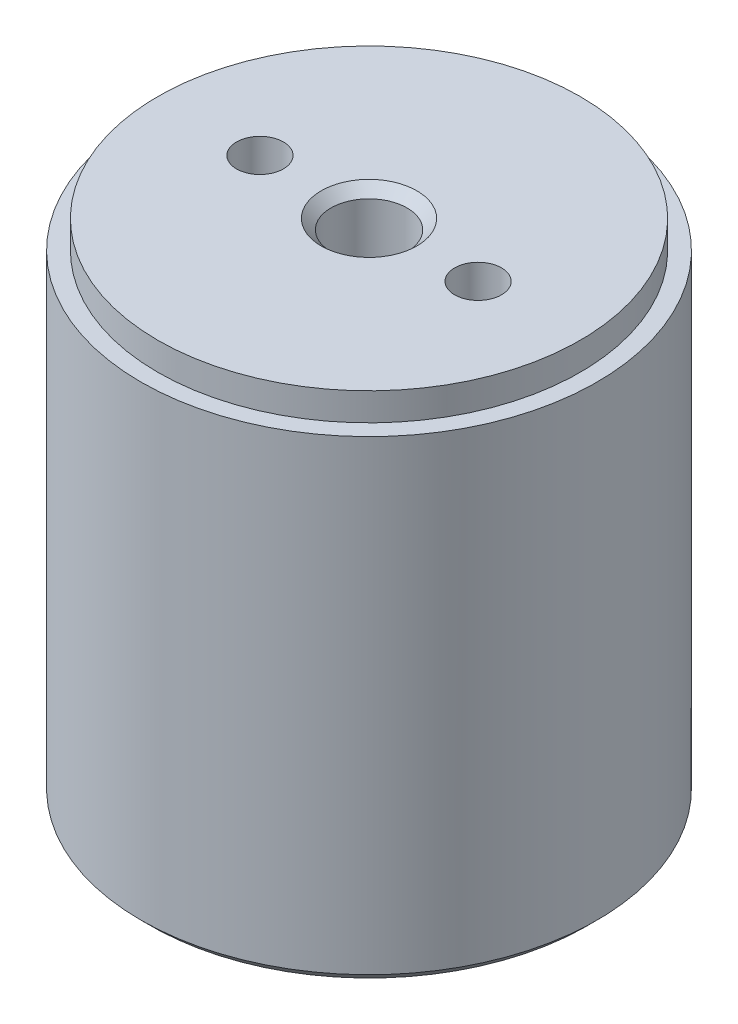
ISO-10303-21;
HEADER;
FILE_DESCRIPTION(('STEP AP214'),'2;1');
FILE_NAME('part.step','',(''),(''),'','','');
FILE_SCHEMA(('AUTOMOTIVE_DESIGN { 1 0 10303 214 1 1 1 1 }'));
ENDSEC;
DATA;
#1=APPLICATION_CONTEXT('core data for automotive mechanical design processes');
#2=APPLICATION_PROTOCOL_DEFINITION('international standard','automotive_design',2000,#1);
#3=PRODUCT_CONTEXT('',#1,'mechanical');
#4=PRODUCT('Part','Part','',(#3));
#5=PRODUCT_RELATED_PRODUCT_CATEGORY('part','',(#4));
#6=PRODUCT_DEFINITION_FORMATION('','',#4);
#7=PRODUCT_DEFINITION_CONTEXT('part definition',#1,'design');
#8=PRODUCT_DEFINITION('design','',#6,#7);
#9=PRODUCT_DEFINITION_SHAPE('','',#8);
#10=(LENGTH_UNIT() NAMED_UNIT(*) SI_UNIT(.MILLI.,.METRE.));
#11=(NAMED_UNIT(*) PLANE_ANGLE_UNIT() SI_UNIT($,.RADIAN.));
#12=(NAMED_UNIT(*) SI_UNIT($,.STERADIAN.) SOLID_ANGLE_UNIT());
#13=UNCERTAINTY_MEASURE_WITH_UNIT(LENGTH_MEASURE(1.E-05),#10,'distance_accuracy_value','');
#14=(GEOMETRIC_REPRESENTATION_CONTEXT(3) GLOBAL_UNCERTAINTY_ASSIGNED_CONTEXT((#13)) GLOBAL_UNIT_ASSIGNED_CONTEXT((#10,
#11,#12)) REPRESENTATION_CONTEXT('',''));
#15=CARTESIAN_POINT('',(0.,0.,0.));
#16=DIRECTION('',(0.,0.,1.));
#17=DIRECTION('',(1.,0.,0.));
#18=AXIS2_PLACEMENT_3D('',#15,#16,#17);
#19=CARTESIAN_POINT('',(0.,-4.,0.));
#20=DIRECTION('',(0.,1.,0.));
#21=DIRECTION('',(0.,0.,1.));
#22=AXIS2_PLACEMENT_3D('',#19,#20,#21);
#23=CYLINDRICAL_SURFACE('',#22,2.413);
#24=CARTESIAN_POINT('',(0.,-3.502,0.));
#25=DIRECTION('',(0.,-1.,0.));
#26=DIRECTION('',(0.,0.,-1.));
#27=AXIS2_PLACEMENT_3D('',#24,#25,#26);
#28=CIRCLE('',#27,2.413);
#29=CARTESIAN_POINT('',(0.,-3.502,-2.413));
#30=VERTEX_POINT('',#29);
#31=EDGE_CURVE('E47',#30,#30,#28,.F.);
#32=ORIENTED_EDGE('',*,*,#31,.T.);
#33=EDGE_LOOP('',(#32));
#34=FACE_BOUND('',#33,.T.);
#35=CARTESIAN_POINT('',(0.,-0.324609432571373,0.));
#36=DIRECTION('',(0.,1.,0.));
#37=DIRECTION('',(0.,0.,1.));
#38=AXIS2_PLACEMENT_3D('',#35,#36,#37);
#39=CIRCLE('',#38,2.413);
#40=CARTESIAN_POINT('',(0.,-0.324609432571373,2.413));
#41=VERTEX_POINT('',#40);
#42=EDGE_CURVE('E71',#41,#41,#39,.T.);
#43=ORIENTED_EDGE('',*,*,#42,.F.);
#44=EDGE_LOOP('',(#43));
#45=FACE_BOUND('',#44,.T.);
#46=ADVANCED_FACE('F32',(#34,#45),#23,.T.);
#47=CARTESIAN_POINT('',(2.413,-4.,0.));
#48=DIRECTION('',(0.,-1.,0.));
#49=DIRECTION('',(0.,0.,-1.));
#50=AXIS2_PLACEMENT_3D('',#47,#48,#49);
#51=PLANE('',#50);
#52=CARTESIAN_POINT('',(0.,-4.,0.));
#53=DIRECTION('',(0.,-1.,0.));
#54=DIRECTION('',(0.,0.,-1.));
#55=AXIS2_PLACEMENT_3D('',#52,#53,#54);
#56=CIRCLE('',#55,1.91499999999999);
#57=CARTESIAN_POINT('',(0.,-4.,-1.91499999999999));
#58=VERTEX_POINT('',#57);
#59=EDGE_CURVE('E43',#58,#58,#56,.T.);
#60=ORIENTED_EDGE('',*,*,#59,.T.);
#61=EDGE_LOOP('',(#60));
#62=FACE_BOUND('',#61,.T.);
#63=CARTESIAN_POINT('',(0.,-4.00000000000001,0.));
#64=DIRECTION('',(0.,-1.,0.));
#65=DIRECTION('',(0.,0.,-1.));
#66=AXIS2_PLACEMENT_3D('',#63,#64,#65);
#67=CIRCLE('',#66,1.18099999999999);
#68=CARTESIAN_POINT('',(0.,-4.00000000000001,-1.18099999999999));
#69=VERTEX_POINT('',#68);
#70=EDGE_CURVE('E94',#69,#69,#67,.T.);
#71=ORIENTED_EDGE('',*,*,#70,.F.);
#72=EDGE_LOOP('',(#71));
#73=FACE_BOUND('',#72,.T.);
#74=ADVANCED_FACE('F135',(#62,#73),#51,.T.);
#75=CARTESIAN_POINT('',(0.,24.,0.));
#76=DIRECTION('',(0.,1.,0.));
#77=DIRECTION('',(0.,0.,1.));
#78=AXIS2_PLACEMENT_3D('',#75,#76,#77);
#79=PLANE('',#78);
#80=CARTESIAN_POINT('',(0.,24.,0.));
#81=DIRECTION('',(0.,1.,0.));
#82=DIRECTION('',(0.,0.,1.));
#83=AXIS2_PLACEMENT_3D('',#80,#81,#82);
#84=CIRCLE('',#83,10.65);
#85=CARTESIAN_POINT('',(0.,24.,10.65));
#86=VERTEX_POINT('',#85);
#87=EDGE_CURVE('E58',#86,#86,#84,.T.);
#88=ORIENTED_EDGE('',*,*,#87,.F.);
#89=EDGE_LOOP('',(#88));
#90=FACE_BOUND('',#89,.T.);
#91=CARTESIAN_POINT('',(0.,24.,0.));
#92=DIRECTION('',(0.,1.,0.));
#93=DIRECTION('',(0.,0.,1.));
#94=AXIS2_PLACEMENT_3D('',#91,#92,#93);
#95=CIRCLE('',#94,11.5);
#96=CARTESIAN_POINT('',(0.,24.,11.5));
#97=VERTEX_POINT('',#96);
#98=EDGE_CURVE('E59',#97,#97,#95,.T.);
#99=ORIENTED_EDGE('',*,*,#98,.T.);
#100=EDGE_LOOP('',(#99));
#101=FACE_BOUND('',#100,.T.);
#102=ADVANCED_FACE('F131',(#90,#101),#79,.T.);
#103=CARTESIAN_POINT('',(0.,-4.,0.));
#104=DIRECTION('',(0.,1.,0.));
#105=DIRECTION('',(0.,0.,1.));
#106=AXIS2_PLACEMENT_3D('',#103,#104,#105);
#107=CYLINDRICAL_SURFACE('',#106,11.5);
#108=CARTESIAN_POINT('',(0.,0.498,0.));
#109=DIRECTION('',(0.,-1.,0.));
#110=DIRECTION('',(0.,0.,-1.));
#111=AXIS2_PLACEMENT_3D('',#108,#109,#110);
#112=CIRCLE('',#111,11.5);
#113=CARTESIAN_POINT('',(0.,0.498,-11.5));
#114=VERTEX_POINT('',#113);
#115=EDGE_CURVE('E55',#114,#114,#112,.F.);
#116=ORIENTED_EDGE('',*,*,#115,.T.);
#117=EDGE_LOOP('',(#116));
#118=FACE_BOUND('',#117,.T.);
#119=ORIENTED_EDGE('',*,*,#98,.F.);
#120=EDGE_LOOP('',(#119));
#121=FACE_BOUND('',#120,.T.);
#122=ADVANCED_FACE('F134',(#118,#121),#107,.T.);
#123=CARTESIAN_POINT('',(11.5,0.,0.));
#124=DIRECTION('',(0.,-1.,0.));
#125=DIRECTION('',(0.,0.,-1.));
#126=AXIS2_PLACEMENT_3D('',#123,#124,#125);
#127=PLANE('',#126);
#128=CARTESIAN_POINT('',(0.,0.,0.));
#129=DIRECTION('',(0.,-1.,0.));
#130=DIRECTION('',(0.,0.,-1.));
#131=AXIS2_PLACEMENT_3D('',#128,#129,#130);
#132=CIRCLE('',#131,11.002);
#133=CARTESIAN_POINT('',(0.,0.,-11.002));
#134=VERTEX_POINT('',#133);
#135=EDGE_CURVE('E52',#134,#134,#132,.T.);
#136=ORIENTED_EDGE('',*,*,#135,.T.);
#137=EDGE_LOOP('',(#136));
#138=FACE_BOUND('',#137,.T.);
#139=CARTESIAN_POINT('',(0.,0.,0.));
#140=DIRECTION('',(0.,1.,0.));
#141=DIRECTION('',(0.,0.,1.));
#142=AXIS2_PLACEMENT_3D('',#139,#140,#141);
#143=CIRCLE('',#142,8.83510678118655);
#144=CARTESIAN_POINT('',(0.,0.,8.83510678118655));
#145=VERTEX_POINT('',#144);
#146=EDGE_CURVE('E62',#145,#145,#143,.T.);
#147=ORIENTED_EDGE('',*,*,#146,.T.);
#148=EDGE_LOOP('',(#147));
#149=FACE_BOUND('',#148,.T.);
#150=ADVANCED_FACE('F140',(#138,#149),#127,.T.);
#151=CARTESIAN_POINT('',(0.,0.25,0.));
#152=DIRECTION('',(0.,1.,0.));
#153=DIRECTION('',(0.,0.,1.));
#154=AXIS2_PLACEMENT_3D('',#151,#152,#153);
#155=TOROIDAL_SURFACE('',#154,8.128,0.750000000000002);
#156=CARTESIAN_POINT('',(0.,0.,0.));
#157=DIRECTION('',(0.,1.,0.));
#158=DIRECTION('',(0.,0.,1.));
#159=AXIS2_PLACEMENT_3D('',#156,#157,#158);
#160=CIRCLE('',#159,7.42089321881345);
#161=CARTESIAN_POINT('',(0.,0.,7.42089321881345));
#162=VERTEX_POINT('',#161);
#163=EDGE_CURVE('E65',#162,#162,#160,.T.);
#164=ORIENTED_EDGE('',*,*,#163,.T.);
#165=EDGE_LOOP('',(#164));
#166=FACE_BOUND('',#165,.T.);
#167=ORIENTED_EDGE('',*,*,#146,.F.);
#168=EDGE_LOOP('',(#167));
#169=FACE_BOUND('',#168,.T.);
#170=ADVANCED_FACE('F146',(#166,#169),#155,.T.);
#171=CARTESIAN_POINT('',(7.42089321881345,0.,0.));
#172=DIRECTION('',(0.,-1.,0.));
#173=DIRECTION('',(0.,0.,-1.));
#174=AXIS2_PLACEMENT_3D('',#171,#172,#173);
#175=PLANE('',#174);
#176=CARTESIAN_POINT('',(5.50000000000004,0.,-1.38777878078145E-13));
#177=DIRECTION('',(0.,-1.,0.));
#178=DIRECTION('',(0.,0.,-1.));
#179=AXIS2_PLACEMENT_3D('',#176,#177,#178);
#180=CIRCLE('',#179,1.18099999999999);
#181=CARTESIAN_POINT('',(5.50000000000004,0.,-1.18100000000013));
#182=VERTEX_POINT('',#181);
#183=EDGE_CURVE('E88',#182,#182,#180,.T.);
#184=ORIENTED_EDGE('',*,*,#183,.F.);
#185=EDGE_LOOP('',(#184));
#186=FACE_BOUND('',#185,.T.);
#187=CARTESIAN_POINT('',(-5.50000000000003,0.,0.));
#188=DIRECTION('',(0.,-1.,0.));
#189=DIRECTION('',(0.,0.,-1.));
#190=AXIS2_PLACEMENT_3D('',#187,#188,#189);
#191=CIRCLE('',#190,1.18099999999999);
#192=CARTESIAN_POINT('',(-5.50000000000003,0.,-1.18100000000002));
#193=VERTEX_POINT('',#192);
#194=EDGE_CURVE('E82',#193,#193,#191,.T.);
#195=ORIENTED_EDGE('',*,*,#194,.F.);
#196=EDGE_LOOP('',(#195));
#197=FACE_BOUND('',#196,.T.);
#198=CARTESIAN_POINT('',(0.,0.,0.));
#199=DIRECTION('',(0.,1.,0.));
#200=DIRECTION('',(0.,0.,1.));
#201=AXIS2_PLACEMENT_3D('',#198,#199,#200);
#202=CIRCLE('',#201,3.60210678118655);
#203=CARTESIAN_POINT('',(0.,0.,3.60210678118655));
#204=VERTEX_POINT('',#203);
#205=EDGE_CURVE('E68',#204,#204,#202,.T.);
#206=ORIENTED_EDGE('',*,*,#205,.T.);
#207=EDGE_LOOP('',(#206));
#208=FACE_BOUND('',#207,.T.);
#209=ORIENTED_EDGE('',*,*,#163,.F.);
#210=EDGE_LOOP('',(#209));
#211=FACE_BOUND('',#210,.T.);
#212=ADVANCED_FACE('F210',(#186,#197,#208,#211),#175,.T.);
#213=CARTESIAN_POINT('',(0.,0.25,0.));
#214=DIRECTION('',(0.,1.,0.));
#215=DIRECTION('',(0.,0.,1.));
#216=AXIS2_PLACEMENT_3D('',#213,#214,#215);
#217=TOROIDAL_SURFACE('',#216,2.895,0.749999999999998);
#218=ORIENTED_EDGE('',*,*,#42,.T.);
#219=EDGE_LOOP('',(#218));
#220=FACE_BOUND('',#219,.T.);
#221=ORIENTED_EDGE('',*,*,#205,.F.);
#222=EDGE_LOOP('',(#221));
#223=FACE_BOUND('',#222,.T.);
#224=ADVANCED_FACE('F127',(#220,#223),#217,.T.);
#225=CARTESIAN_POINT('',(0.,25.4,0.));
#226=DIRECTION('',(0.,-1.,0.));
#227=DIRECTION('',(0.,0.,-1.));
#228=AXIS2_PLACEMENT_3D('',#225,#226,#227);
#229=CYLINDRICAL_SURFACE('',#228,10.65);
#230=CARTESIAN_POINT('',(0.,25.4,0.));
#231=DIRECTION('',(0.,1.,0.));
#232=DIRECTION('',(0.,0.,1.));
#233=AXIS2_PLACEMENT_3D('',#230,#231,#232);
#234=CIRCLE('',#233,10.65);
#235=CARTESIAN_POINT('',(0.,25.4,10.65));
#236=VERTEX_POINT('',#235);
#237=EDGE_CURVE('E74',#236,#236,#234,.T.);
#238=ORIENTED_EDGE('',*,*,#237,.F.);
#239=EDGE_LOOP('',(#238));
#240=FACE_BOUND('',#239,.T.);
#241=ORIENTED_EDGE('',*,*,#87,.T.);
#242=EDGE_LOOP('',(#241));
#243=FACE_BOUND('',#242,.T.);
#244=ADVANCED_FACE('F119',(#240,#243),#229,.T.);
#245=CARTESIAN_POINT('',(0.,25.4,0.));
#246=DIRECTION('',(0.,1.,0.));
#247=DIRECTION('',(0.,0.,1.));
#248=AXIS2_PLACEMENT_3D('',#245,#246,#247);
#249=PLANE('',#248);
#250=CARTESIAN_POINT('',(0.,25.4,0.));
#251=DIRECTION('',(0.,1.,0.));
#252=DIRECTION('',(0.,0.,1.));
#253=AXIS2_PLACEMENT_3D('',#250,#251,#252);
#254=CIRCLE('',#253,2.41299999999998);
#255=CARTESIAN_POINT('',(0.,25.4,2.41299999999998));
#256=VERTEX_POINT('',#255);
#257=EDGE_CURVE('E10',#256,#256,#254,.F.);
#258=ORIENTED_EDGE('',*,*,#257,.T.);
#259=EDGE_LOOP('',(#258));
#260=FACE_BOUND('',#259,.T.);
#261=CARTESIAN_POINT('',(5.50000000000004,25.4,-1.38777878078145E-13));
#262=DIRECTION('',(0.,1.,0.));
#263=DIRECTION('',(0.,0.,1.));
#264=AXIS2_PLACEMENT_3D('',#261,#262,#263);
#265=CIRCLE('',#264,1.18099999999999);
#266=CARTESIAN_POINT('',(5.50000000000004,25.4,1.18099999999985));
#267=VERTEX_POINT('',#266);
#268=EDGE_CURVE('E109',#267,#267,#265,.T.);
#269=ORIENTED_EDGE('',*,*,#268,.F.);
#270=EDGE_LOOP('',(#269));
#271=FACE_BOUND('',#270,.T.);
#272=CARTESIAN_POINT('',(-5.50000000000003,25.4,0.));
#273=DIRECTION('',(0.,1.,0.));
#274=DIRECTION('',(0.,0.,1.));
#275=AXIS2_PLACEMENT_3D('',#272,#273,#274);
#276=CIRCLE('',#275,1.18099999999999);
#277=CARTESIAN_POINT('',(-5.50000000000003,25.4,1.18099999999996));
#278=VERTEX_POINT('',#277);
#279=EDGE_CURVE('E103',#278,#278,#276,.T.);
#280=ORIENTED_EDGE('',*,*,#279,.F.);
#281=EDGE_LOOP('',(#280));
#282=FACE_BOUND('',#281,.T.);
#283=ORIENTED_EDGE('',*,*,#237,.T.);
#284=EDGE_LOOP('',(#283));
#285=FACE_BOUND('',#284,.T.);
#286=ADVANCED_FACE('F115',(#260,#271,#282,#285),#249,.T.);
#287=CARTESIAN_POINT('',(-5.50000000000003,5.,0.));
#288=DIRECTION('',(0.,1.,0.));
#289=DIRECTION('',(0.,0.,1.));
#290=AXIS2_PLACEMENT_3D('',#287,#288,#289);
#291=PLANE('',#290);
#292=CARTESIAN_POINT('',(-5.50000000000003,5.,0.));
#293=DIRECTION('',(0.,-1.,0.));
#294=DIRECTION('',(0.,0.,-1.));
#295=AXIS2_PLACEMENT_3D('',#292,#293,#294);
#296=CIRCLE('',#295,1.18099999999999);
#297=CARTESIAN_POINT('',(-5.50000000000003,5.,-1.18100000000002));
#298=VERTEX_POINT('',#297);
#299=EDGE_CURVE('E79',#298,#298,#296,.T.);
#300=ORIENTED_EDGE('',*,*,#299,.T.);
#301=EDGE_LOOP('',(#300));
#302=FACE_BOUND('',#301,.T.);
#303=ADVANCED_FACE('F118',(#302),#291,.F.);
#304=CARTESIAN_POINT('',(-5.50000000000003,0.,0.));
#305=DIRECTION('',(0.,-1.,0.));
#306=DIRECTION('',(0.,0.,-1.));
#307=AXIS2_PLACEMENT_3D('',#304,#305,#306);
#308=CYLINDRICAL_SURFACE('',#307,1.18099999999999);
#309=ORIENTED_EDGE('',*,*,#299,.F.);
#310=EDGE_LOOP('',(#309));
#311=FACE_BOUND('',#310,.T.);
#312=ORIENTED_EDGE('',*,*,#194,.T.);
#313=EDGE_LOOP('',(#312));
#314=FACE_BOUND('',#313,.T.);
#315=ADVANCED_FACE('F200',(#311,#314),#308,.F.);
#316=CARTESIAN_POINT('',(5.50000000000004,5.,-1.38777878078145E-13));
#317=DIRECTION('',(0.,1.,0.));
#318=DIRECTION('',(0.,0.,1.));
#319=AXIS2_PLACEMENT_3D('',#316,#317,#318);
#320=PLANE('',#319);
#321=CARTESIAN_POINT('',(5.50000000000004,5.,-1.38777878078145E-13));
#322=DIRECTION('',(0.,-1.,0.));
#323=DIRECTION('',(0.,0.,-1.));
#324=AXIS2_PLACEMENT_3D('',#321,#322,#323);
#325=CIRCLE('',#324,1.18099999999999);
#326=CARTESIAN_POINT('',(5.50000000000004,5.,-1.18100000000013));
#327=VERTEX_POINT('',#326);
#328=EDGE_CURVE('E85',#327,#327,#325,.T.);
#329=ORIENTED_EDGE('',*,*,#328,.T.);
#330=EDGE_LOOP('',(#329));
#331=FACE_BOUND('',#330,.T.);
#332=ADVANCED_FACE('F196',(#331),#320,.F.);
#333=CARTESIAN_POINT('',(5.50000000000004,0.,-1.38777878078145E-13));
#334=DIRECTION('',(0.,-1.,0.));
#335=DIRECTION('',(0.,0.,-1.));
#336=AXIS2_PLACEMENT_3D('',#333,#334,#335);
#337=CYLINDRICAL_SURFACE('',#336,1.18099999999999);
#338=ORIENTED_EDGE('',*,*,#328,.F.);
#339=EDGE_LOOP('',(#338));
#340=FACE_BOUND('',#339,.T.);
#341=ORIENTED_EDGE('',*,*,#183,.T.);
#342=EDGE_LOOP('',(#341));
#343=FACE_BOUND('',#342,.T.);
#344=ADVANCED_FACE('F188',(#340,#343),#337,.F.);
#345=CARTESIAN_POINT('',(0.,5.,0.));
#346=DIRECTION('',(0.,1.,0.));
#347=DIRECTION('',(0.,0.,1.));
#348=AXIS2_PLACEMENT_3D('',#345,#346,#347);
#349=PLANE('',#348);
#350=CARTESIAN_POINT('',(0.,5.,0.));
#351=DIRECTION('',(0.,-1.,0.));
#352=DIRECTION('',(0.,0.,-1.));
#353=AXIS2_PLACEMENT_3D('',#350,#351,#352);
#354=CIRCLE('',#353,1.18099999999999);
#355=CARTESIAN_POINT('',(0.,5.,-1.18099999999999));
#356=VERTEX_POINT('',#355);
#357=EDGE_CURVE('E91',#356,#356,#354,.T.);
#358=ORIENTED_EDGE('',*,*,#357,.T.);
#359=EDGE_LOOP('',(#358));
#360=FACE_BOUND('',#359,.T.);
#361=ADVANCED_FACE('F178',(#360),#349,.F.);
#362=CARTESIAN_POINT('',(0.,-4.,0.));
#363=DIRECTION('',(0.,-1.,0.));
#364=DIRECTION('',(0.,0.,-1.));
#365=AXIS2_PLACEMENT_3D('',#362,#363,#364);
#366=CYLINDRICAL_SURFACE('',#365,1.18099999999999);
#367=ORIENTED_EDGE('',*,*,#357,.F.);
#368=EDGE_LOOP('',(#367));
#369=FACE_BOUND('',#368,.T.);
#370=ORIENTED_EDGE('',*,*,#70,.T.);
#371=EDGE_LOOP('',(#370));
#372=FACE_BOUND('',#371,.T.);
#373=ADVANCED_FACE('F175',(#369,#372),#366,.F.);
#374=CARTESIAN_POINT('',(0.,20.4,0.));
#375=DIRECTION('',(0.,-1.,0.));
#376=DIRECTION('',(0.,0.,-1.));
#377=AXIS2_PLACEMENT_3D('',#374,#375,#376);
#378=PLANE('',#377);
#379=CARTESIAN_POINT('',(0.,20.4,0.));
#380=DIRECTION('',(0.,1.,0.));
#381=DIRECTION('',(0.,0.,1.));
#382=AXIS2_PLACEMENT_3D('',#379,#380,#381);
#383=CIRCLE('',#382,1.91499999999999);
#384=CARTESIAN_POINT('',(0.,20.4,1.91499999999999));
#385=VERTEX_POINT('',#384);
#386=EDGE_CURVE('E97',#385,#385,#383,.T.);
#387=ORIENTED_EDGE('',*,*,#386,.T.);
#388=EDGE_LOOP('',(#387));
#389=FACE_BOUND('',#388,.T.);
#390=ADVANCED_FACE('F177',(#389),#378,.F.);
#391=CARTESIAN_POINT('',(0.,25.4,0.));
#392=DIRECTION('',(0.,1.,0.));
#393=DIRECTION('',(0.,0.,1.));
#394=AXIS2_PLACEMENT_3D('',#391,#392,#393);
#395=CYLINDRICAL_SURFACE('',#394,1.91499999999999);
#396=CARTESIAN_POINT('',(0.,24.902,0.));
#397=DIRECTION('',(0.,1.,0.));
#398=DIRECTION('',(0.,0.,1.));
#399=AXIS2_PLACEMENT_3D('',#396,#397,#398);
#400=CIRCLE('',#399,1.91499999999999);
#401=CARTESIAN_POINT('',(0.,24.902,1.91499999999999));
#402=VERTEX_POINT('',#401);
#403=EDGE_CURVE('E39',#402,#402,#400,.T.);
#404=ORIENTED_EDGE('',*,*,#403,.T.);
#405=EDGE_LOOP('',(#404));
#406=FACE_BOUND('',#405,.T.);
#407=ORIENTED_EDGE('',*,*,#386,.F.);
#408=EDGE_LOOP('',(#407));
#409=FACE_BOUND('',#408,.T.);
#410=ADVANCED_FACE('F185',(#406,#409),#395,.F.);
#411=CARTESIAN_POINT('',(-5.50000000000003,20.4,0.));
#412=DIRECTION('',(0.,-1.,0.));
#413=DIRECTION('',(0.,0.,-1.));
#414=AXIS2_PLACEMENT_3D('',#411,#412,#413);
#415=PLANE('',#414);
#416=CARTESIAN_POINT('',(-5.50000000000003,20.4,0.));
#417=DIRECTION('',(0.,1.,0.));
#418=DIRECTION('',(0.,0.,1.));
#419=AXIS2_PLACEMENT_3D('',#416,#417,#418);
#420=CIRCLE('',#419,1.18099999999999);
#421=CARTESIAN_POINT('',(-5.50000000000003,20.4,1.18099999999996));
#422=VERTEX_POINT('',#421);
#423=EDGE_CURVE('E100',#422,#422,#420,.T.);
#424=ORIENTED_EDGE('',*,*,#423,.T.);
#425=EDGE_LOOP('',(#424));
#426=FACE_BOUND('',#425,.T.);
#427=ADVANCED_FACE('F281',(#426),#415,.F.);
#428=CARTESIAN_POINT('',(-5.50000000000003,25.4,0.));
#429=DIRECTION('',(0.,1.,0.));
#430=DIRECTION('',(0.,0.,1.));
#431=AXIS2_PLACEMENT_3D('',#428,#429,#430);
#432=CYLINDRICAL_SURFACE('',#431,1.18099999999999);
#433=ORIENTED_EDGE('',*,*,#423,.F.);
#434=EDGE_LOOP('',(#433));
#435=FACE_BOUND('',#434,.T.);
#436=ORIENTED_EDGE('',*,*,#279,.T.);
#437=EDGE_LOOP('',(#436));
#438=FACE_BOUND('',#437,.T.);
#439=ADVANCED_FACE('F286',(#435,#438),#432,.F.);
#440=CARTESIAN_POINT('',(5.50000000000004,20.4,-1.38777878078145E-13));
#441=DIRECTION('',(0.,-1.,0.));
#442=DIRECTION('',(0.,0.,-1.));
#443=AXIS2_PLACEMENT_3D('',#440,#441,#442);
#444=PLANE('',#443);
#445=CARTESIAN_POINT('',(5.50000000000004,20.4,-1.38777878078145E-13));
#446=DIRECTION('',(0.,1.,0.));
#447=DIRECTION('',(0.,0.,1.));
#448=AXIS2_PLACEMENT_3D('',#445,#446,#447);
#449=CIRCLE('',#448,1.18099999999999);
#450=CARTESIAN_POINT('',(5.50000000000004,20.4,1.18099999999985));
#451=VERTEX_POINT('',#450);
#452=EDGE_CURVE('E106',#451,#451,#449,.T.);
#453=ORIENTED_EDGE('',*,*,#452,.T.);
#454=EDGE_LOOP('',(#453));
#455=FACE_BOUND('',#454,.T.);
#456=ADVANCED_FACE('F296',(#455),#444,.F.);
#457=CARTESIAN_POINT('',(5.50000000000004,25.4,-1.38777878078145E-13));
#458=DIRECTION('',(0.,1.,0.));
#459=DIRECTION('',(0.,0.,1.));
#460=AXIS2_PLACEMENT_3D('',#457,#458,#459);
#461=CYLINDRICAL_SURFACE('',#460,1.18099999999999);
#462=ORIENTED_EDGE('',*,*,#452,.F.);
#463=EDGE_LOOP('',(#462));
#464=FACE_BOUND('',#463,.T.);
#465=ORIENTED_EDGE('',*,*,#268,.T.);
#466=EDGE_LOOP('',(#465));
#467=FACE_BOUND('',#466,.T.);
#468=ADVANCED_FACE('F113',(#464,#467),#461,.F.);
#469=CARTESIAN_POINT('',(0.,0.498,0.));
#470=DIRECTION('',(0.,1.,0.));
#471=DIRECTION('',(0.,0.,1.));
#472=AXIS2_PLACEMENT_3D('',#469,#470,#471);
#473=CONICAL_SURFACE('',#472,11.5,0.785398163397454);
#474=ORIENTED_EDGE('',*,*,#135,.F.);
#475=EDGE_LOOP('',(#474));
#476=FACE_BOUND('',#475,.T.);
#477=ORIENTED_EDGE('',*,*,#115,.F.);
#478=EDGE_LOOP('',(#477));
#479=FACE_BOUND('',#478,.T.);
#480=ADVANCED_FACE('F159',(#476,#479),#473,.T.);
#481=CARTESIAN_POINT('',(0.,-3.502,0.));
#482=DIRECTION('',(0.,1.,0.));
#483=DIRECTION('',(0.,0.,1.));
#484=AXIS2_PLACEMENT_3D('',#481,#482,#483);
#485=CONICAL_SURFACE('',#484,2.413,0.785398163397454);
#486=ORIENTED_EDGE('',*,*,#59,.F.);
#487=EDGE_LOOP('',(#486));
#488=FACE_BOUND('',#487,.T.);
#489=ORIENTED_EDGE('',*,*,#31,.F.);
#490=EDGE_LOOP('',(#489));
#491=FACE_BOUND('',#490,.T.);
#492=ADVANCED_FACE('F161',(#488,#491),#485,.T.);
#493=CARTESIAN_POINT('',(0.,24.902,0.));
#494=DIRECTION('',(0.,1.,0.));
#495=DIRECTION('',(0.,0.,1.));
#496=AXIS2_PLACEMENT_3D('',#493,#494,#495);
#497=CONICAL_SURFACE('',#496,1.91499999999999,0.785398163397453);
#498=ORIENTED_EDGE('',*,*,#257,.F.);
#499=EDGE_LOOP('',(#498));
#500=FACE_BOUND('',#499,.T.);
#501=ORIENTED_EDGE('',*,*,#403,.F.);
#502=EDGE_LOOP('',(#501));
#503=FACE_BOUND('',#502,.T.);
#504=ADVANCED_FACE('F34',(#500,#503),#497,.F.);
#505=CLOSED_SHELL('',(#46,#74,#102,#122,#150,#170,#212,#224,#244,#286,#303,#315,#332,#344,#361,
#373,#390,#410,#427,#439,#456,#468,#480,#492,#504));
#506=MANIFOLD_SOLID_BREP('B2',#505);
#507=ADVANCED_BREP_SHAPE_REPRESENTATION('',(#18,#506),#14);
#508=SHAPE_DEFINITION_REPRESENTATION(#9,#507);
ENDSEC;
END-ISO-10303-21;
